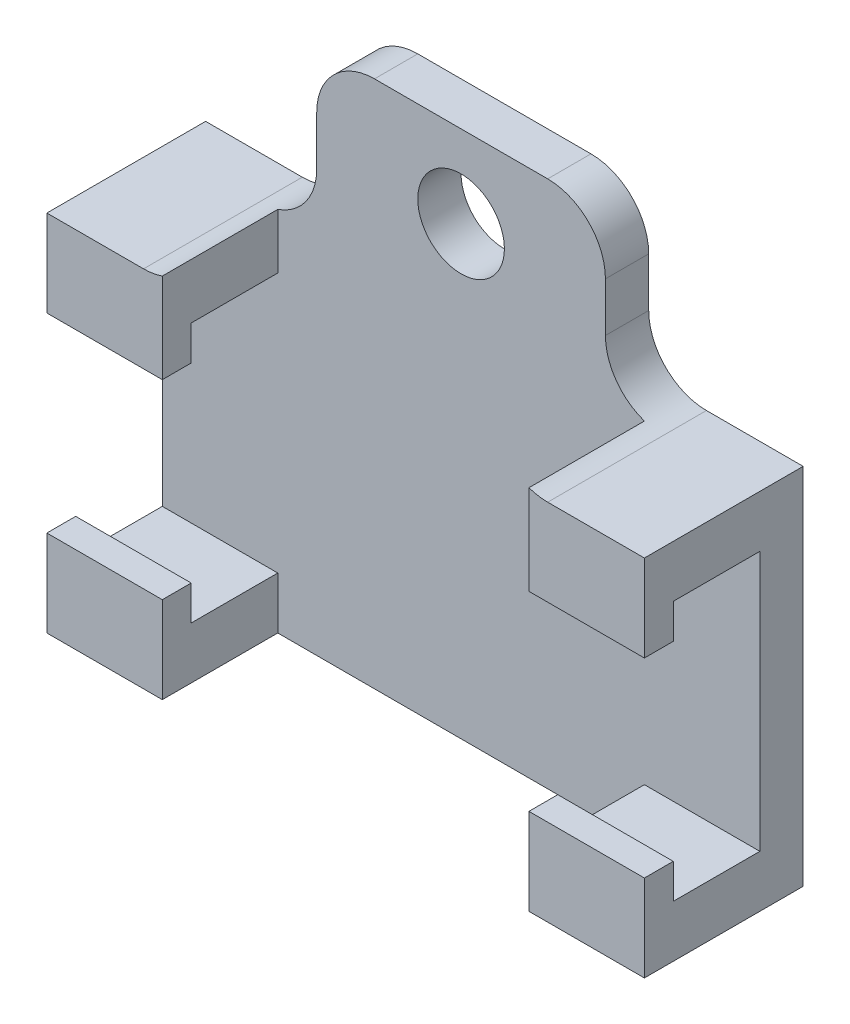
ISO-10303-21;
HEADER;
FILE_DESCRIPTION(('STEP AP214'),'2;1');
FILE_NAME('part.step','',(''),(''),'','','');
FILE_SCHEMA(('AUTOMOTIVE_DESIGN { 1 0 10303 214 1 1 1 1 }'));
ENDSEC;
DATA;
#1=APPLICATION_CONTEXT('core data for automotive mechanical design processes');
#2=APPLICATION_PROTOCOL_DEFINITION('international standard','automotive_design',2000,#1);
#3=PRODUCT_CONTEXT('',#1,'mechanical');
#4=PRODUCT('Part','Part','',(#3));
#5=PRODUCT_RELATED_PRODUCT_CATEGORY('part','',(#4));
#6=PRODUCT_DEFINITION_FORMATION('','',#4);
#7=PRODUCT_DEFINITION_CONTEXT('part definition',#1,'design');
#8=PRODUCT_DEFINITION('design','',#6,#7);
#9=PRODUCT_DEFINITION_SHAPE('','',#8);
#10=(LENGTH_UNIT() NAMED_UNIT(*) SI_UNIT(.MILLI.,.METRE.));
#11=(NAMED_UNIT(*) PLANE_ANGLE_UNIT() SI_UNIT($,.RADIAN.));
#12=(NAMED_UNIT(*) SI_UNIT($,.STERADIAN.) SOLID_ANGLE_UNIT());
#13=UNCERTAINTY_MEASURE_WITH_UNIT(LENGTH_MEASURE(1.E-05),#10,'distance_accuracy_value','');
#14=(GEOMETRIC_REPRESENTATION_CONTEXT(3) GLOBAL_UNCERTAINTY_ASSIGNED_CONTEXT((#13)) GLOBAL_UNIT_ASSIGNED_CONTEXT((#10,
#11,#12)) REPRESENTATION_CONTEXT('',''));
#15=CARTESIAN_POINT('',(0.,0.,0.));
#16=DIRECTION('',(0.,0.,1.));
#17=DIRECTION('',(1.,0.,0.));
#18=AXIS2_PLACEMENT_3D('',#15,#16,#17);
#19=CARTESIAN_POINT('',(0.,-2.65,-17.95));
#20=DIRECTION('',(0.,1.,0.));
#21=DIRECTION('',(-1.,0.,0.));
#22=AXIS2_PLACEMENT_3D('',#19,#20,#21);
#23=PLANE('',#22);
#24=DIRECTION('',(-1.,0.,0.));
#25=VECTOR('',#24,1.);
#26=CARTESIAN_POINT('',(0.,-2.65,-18.95));
#27=LINE('',#26,#25);
#28=CARTESIAN_POINT('',(4.,-2.65,-18.95));
#29=VERTEX_POINT('',#28);
#30=CARTESIAN_POINT('',(0.,-2.65,-18.95));
#31=VERTEX_POINT('',#30);
#32=EDGE_CURVE('E450',#29,#31,#27,.T.);
#33=ORIENTED_EDGE('',*,*,#32,.F.);
#34=DIRECTION('',(0.,0.,1.));
#35=VECTOR('',#34,1.);
#36=CARTESIAN_POINT('',(4.,-2.65,-17.95));
#37=LINE('',#36,#35);
#38=CARTESIAN_POINT('',(4.,-2.65,-17.95));
#39=VERTEX_POINT('',#38);
#40=EDGE_CURVE('E419',#29,#39,#37,.T.);
#41=ORIENTED_EDGE('',*,*,#40,.T.);
#42=DIRECTION('',(1.,0.,0.));
#43=VECTOR('',#42,1.);
#44=CARTESIAN_POINT('',(0.,-2.65,-17.95));
#45=LINE('',#44,#43);
#46=CARTESIAN_POINT('',(0.,-2.65,-17.95));
#47=VERTEX_POINT('',#46);
#48=EDGE_CURVE('E498',#47,#39,#45,.T.);
#49=ORIENTED_EDGE('',*,*,#48,.F.);
#50=DIRECTION('',(0.,0.,-1.));
#51=VECTOR('',#50,1.);
#52=CARTESIAN_POINT('',(0.,-2.65,-17.95));
#53=LINE('',#52,#51);
#54=EDGE_CURVE('E280',#47,#31,#53,.T.);
#55=ORIENTED_EDGE('',*,*,#54,.T.);
#56=EDGE_LOOP('',(#33,#41,#49,#55));
#57=FACE_BOUND('',#56,.T.);
#58=ADVANCED_FACE('F39',(#57),#23,.F.);
#59=CARTESIAN_POINT('',(0.,0.349999999999996,-17.95));
#60=DIRECTION('',(0.,-1.,0.));
#61=DIRECTION('',(1.,0.,0.));
#62=AXIS2_PLACEMENT_3D('',#59,#60,#61);
#63=PLANE('',#62);
#64=DIRECTION('',(-1.,0.,0.));
#65=VECTOR('',#64,1.);
#66=CARTESIAN_POINT('',(0.,0.349999999999996,-17.95));
#67=LINE('',#66,#65);
#68=CARTESIAN_POINT('',(3.35,0.349999999999996,-17.95));
#69=VERTEX_POINT('',#68);
#70=CARTESIAN_POINT('',(0.,0.349999999999996,-17.95));
#71=VERTEX_POINT('',#70);
#72=EDGE_CURVE('E503',#69,#71,#67,.T.);
#73=ORIENTED_EDGE('',*,*,#72,.F.);
#74=DIRECTION('',(0.,0.,1.));
#75=VECTOR('',#74,1.);
#76=CARTESIAN_POINT('',(3.35,0.350000000000017,-23.45));
#77=LINE('',#76,#75);
#78=CARTESIAN_POINT('',(3.35,0.350000000000017,-23.45));
#79=VERTEX_POINT('',#78);
#80=EDGE_CURVE('E266',#69,#79,#77,.F.);
#81=ORIENTED_EDGE('',*,*,#80,.T.);
#82=DIRECTION('',(1.,0.,0.));
#83=VECTOR('',#82,1.);
#84=CARTESIAN_POINT('',(0.,0.350000000000017,-23.45));
#85=LINE('',#84,#83);
#86=CARTESIAN_POINT('',(0.,0.350000000000017,-23.45));
#87=VERTEX_POINT('',#86);
#88=EDGE_CURVE('E263',#87,#79,#85,.T.);
#89=ORIENTED_EDGE('',*,*,#88,.F.);
#90=DIRECTION('',(0.,0.,-1.));
#91=VECTOR('',#90,1.);
#92=CARTESIAN_POINT('',(0.,0.349999999999996,-17.95));
#93=LINE('',#92,#91);
#94=EDGE_CURVE('E247',#71,#87,#93,.T.);
#95=ORIENTED_EDGE('',*,*,#94,.F.);
#96=EDGE_LOOP('',(#73,#81,#89,#95));
#97=FACE_BOUND('',#96,.T.);
#98=ADVANCED_FACE('F264',(#97),#63,.F.);
#99=CARTESIAN_POINT('',(0.,-17.95,-17.9500000000001));
#100=DIRECTION('',(0.,0.,-1.));
#101=DIRECTION('',(0.,1.,0.));
#102=AXIS2_PLACEMENT_3D('',#99,#100,#101);
#103=PLANE('',#102);
#104=ORIENTED_EDGE('',*,*,#48,.T.);
#105=DIRECTION('',(0.,-1.,0.));
#106=VECTOR('',#105,1.);
#107=CARTESIAN_POINT('',(4.,6.04999999999999,-17.95));
#108=LINE('',#107,#106);
#109=CARTESIAN_POINT('',(4.,0.458571968062201,-17.95));
#110=VERTEX_POINT('',#109);
#111=EDGE_CURVE('E384',#110,#39,#108,.T.);
#112=ORIENTED_EDGE('',*,*,#111,.F.);
#113=CARTESIAN_POINT('',(3.35,2.35,-17.95));
#114=DIRECTION('',(0.,0.,-1.));
#115=DIRECTION('',(0.,1.,0.));
#116=AXIS2_PLACEMENT_3D('',#113,#114,#115);
#117=CIRCLE('',#116,2.);
#118=EDGE_CURVE('E334',#110,#69,#117,.T.);
#119=ORIENTED_EDGE('',*,*,#118,.T.);
#120=ORIENTED_EDGE('',*,*,#72,.T.);
#121=DIRECTION('',(0.,-1.,0.));
#122=VECTOR('',#121,1.);
#123=CARTESIAN_POINT('',(0.,-2.65,-17.95));
#124=LINE('',#123,#122);
#125=EDGE_CURVE('E256',#71,#47,#124,.T.);
#126=ORIENTED_EDGE('',*,*,#125,.T.);
#127=EDGE_LOOP('',(#104,#112,#119,#120,#126));
#128=FACE_BOUND('',#127,.T.);
#129=ADVANCED_FACE('F621',(#128),#103,.F.);
#130=CARTESIAN_POINT('',(0.,-9.25000000000001,-17.95));
#131=DIRECTION('',(0.,-1.,0.));
#132=DIRECTION('',(1.,0.,0.));
#133=AXIS2_PLACEMENT_3D('',#130,#131,#132);
#134=PLANE('',#133);
#135=DIRECTION('',(-1.,0.,0.));
#136=VECTOR('',#135,1.);
#137=CARTESIAN_POINT('',(0.,-9.25000000000001,-17.95));
#138=LINE('',#137,#136);
#139=CARTESIAN_POINT('',(4.,-9.25000000000001,-17.95));
#140=VERTEX_POINT('',#139);
#141=CARTESIAN_POINT('',(0.,-9.25000000000001,-17.95));
#142=VERTEX_POINT('',#141);
#143=EDGE_CURVE('E482',#140,#142,#138,.T.);
#144=ORIENTED_EDGE('',*,*,#143,.F.);
#145=DIRECTION('',(0.,0.,-1.));
#146=VECTOR('',#145,1.);
#147=CARTESIAN_POINT('',(4.,-9.25000000000001,-17.95));
#148=LINE('',#147,#146);
#149=CARTESIAN_POINT('',(4.,-9.25,-18.95));
#150=VERTEX_POINT('',#149);
#151=EDGE_CURVE('E410',#140,#150,#148,.T.);
#152=ORIENTED_EDGE('',*,*,#151,.T.);
#153=DIRECTION('',(1.,0.,0.));
#154=VECTOR('',#153,1.);
#155=CARTESIAN_POINT('',(20.7,-9.25,-18.95));
#156=LINE('',#155,#154);
#157=CARTESIAN_POINT('',(0.,-9.25,-18.95));
#158=VERTEX_POINT('',#157);
#159=EDGE_CURVE('E434',#158,#150,#156,.T.);
#160=ORIENTED_EDGE('',*,*,#159,.F.);
#161=DIRECTION('',(0.,0.,-1.));
#162=VECTOR('',#161,1.);
#163=CARTESIAN_POINT('',(0.,-9.25000000000001,-17.95));
#164=LINE('',#163,#162);
#165=EDGE_CURVE('E486',#142,#158,#164,.T.);
#166=ORIENTED_EDGE('',*,*,#165,.F.);
#167=EDGE_LOOP('',(#144,#152,#160,#166));
#168=FACE_BOUND('',#167,.T.);
#169=ADVANCED_FACE('F558',(#168),#134,.F.);
#170=CARTESIAN_POINT('',(0.,-17.95,-17.9500000000001));
#171=DIRECTION('',(0.,0.,1.));
#172=DIRECTION('',(0.,-1.,0.));
#173=AXIS2_PLACEMENT_3D('',#170,#171,#172);
#174=PLANE('',#173);
#175=CARTESIAN_POINT('',(4.,-12.25,-17.9500000000001));
#176=VERTEX_POINT('',#175);
#177=EDGE_CURVE('E382',#140,#176,#108,.T.);
#178=ORIENTED_EDGE('',*,*,#177,.F.);
#179=ORIENTED_EDGE('',*,*,#143,.T.);
#180=DIRECTION('',(0.,-1.,0.));
#181=VECTOR('',#180,1.);
#182=CARTESIAN_POINT('',(0.,-9.25000000000001,-17.95));
#183=LINE('',#182,#181);
#184=CARTESIAN_POINT('',(0.,-12.25,-17.9500000000001));
#185=VERTEX_POINT('',#184);
#186=EDGE_CURVE('E472',#142,#185,#183,.T.);
#187=ORIENTED_EDGE('',*,*,#186,.T.);
#188=DIRECTION('',(1.,0.,0.));
#189=VECTOR('',#188,1.);
#190=CARTESIAN_POINT('',(0.,-12.25,-17.9500000000001));
#191=LINE('',#190,#189);
#192=EDGE_CURVE('E477',#185,#176,#191,.T.);
#193=ORIENTED_EDGE('',*,*,#192,.T.);
#194=EDGE_LOOP('',(#178,#179,#187,#193));
#195=FACE_BOUND('',#194,.T.);
#196=ADVANCED_FACE('F562',(#195),#174,.T.);
#197=CARTESIAN_POINT('',(0.,-1.45,-18.95));
#198=DIRECTION('',(0.,0.,1.));
#199=DIRECTION('',(0.,-1.,0.));
#200=AXIS2_PLACEMENT_3D('',#197,#198,#199);
#201=PLANE('',#200);
#202=DIRECTION('',(-1.,0.,0.));
#203=VECTOR('',#202,1.);
#204=CARTESIAN_POINT('',(0.,-1.45,-18.95));
#205=LINE('',#204,#203);
#206=CARTESIAN_POINT('',(4.,-1.45,-18.95));
#207=VERTEX_POINT('',#206);
#208=CARTESIAN_POINT('',(0.,-1.45,-18.95));
#209=VERTEX_POINT('',#208);
#210=EDGE_CURVE('E462',#207,#209,#205,.T.);
#211=ORIENTED_EDGE('',*,*,#210,.F.);
#212=DIRECTION('',(0.,-1.,0.));
#213=VECTOR('',#212,1.);
#214=CARTESIAN_POINT('',(4.,-1.45,-18.95));
#215=LINE('',#214,#213);
#216=EDGE_CURVE('E416',#207,#29,#215,.T.);
#217=ORIENTED_EDGE('',*,*,#216,.T.);
#218=ORIENTED_EDGE('',*,*,#32,.T.);
#219=DIRECTION('',(0.,-1.,0.));
#220=VECTOR('',#219,1.);
#221=CARTESIAN_POINT('',(0.,-1.45,-18.95));
#222=LINE('',#221,#220);
#223=EDGE_CURVE('E469',#209,#31,#222,.T.);
#224=ORIENTED_EDGE('',*,*,#223,.F.);
#225=EDGE_LOOP('',(#211,#217,#218,#224));
#226=FACE_BOUND('',#225,.T.);
#227=ADVANCED_FACE('F750',(#226),#201,.F.);
#228=CARTESIAN_POINT('',(0.,-1.44999999999999,-23.45));
#229=DIRECTION('',(0.,1.,0.));
#230=DIRECTION('',(-1.,0.,0.));
#231=AXIS2_PLACEMENT_3D('',#228,#229,#230);
#232=PLANE('',#231);
#233=DIRECTION('',(1.,0.,0.));
#234=VECTOR('',#233,1.);
#235=CARTESIAN_POINT('',(0.,-1.44999999999999,-21.95));
#236=LINE('',#235,#234);
#237=CARTESIAN_POINT('',(0.,-1.44999999999999,-21.95));
#238=VERTEX_POINT('',#237);
#239=CARTESIAN_POINT('',(4.,-1.44999999999999,-21.95));
#240=VERTEX_POINT('',#239);
#241=EDGE_CURVE('E457',#238,#240,#236,.T.);
#242=ORIENTED_EDGE('',*,*,#241,.T.);
#243=DIRECTION('',(0.,0.,1.));
#244=VECTOR('',#243,1.);
#245=CARTESIAN_POINT('',(4.,-1.44999999999999,-23.45));
#246=LINE('',#245,#244);
#247=EDGE_CURVE('E413',#240,#207,#246,.T.);
#248=ORIENTED_EDGE('',*,*,#247,.T.);
#249=ORIENTED_EDGE('',*,*,#210,.T.);
#250=DIRECTION('',(0.,0.,-1.));
#251=VECTOR('',#250,1.);
#252=CARTESIAN_POINT('',(0.,-1.44999999999999,-21.95));
#253=LINE('',#252,#251);
#254=EDGE_CURVE('E452',#209,#238,#253,.T.);
#255=ORIENTED_EDGE('',*,*,#254,.T.);
#256=EDGE_LOOP('',(#242,#248,#249,#255));
#257=FACE_BOUND('',#256,.T.);
#258=ADVANCED_FACE('F542',(#257),#232,.F.);
#259=CARTESIAN_POINT('',(20.7,-10.45,-18.95));
#260=DIRECTION('',(0.,0.,1.));
#261=DIRECTION('',(0.,-1.,0.));
#262=AXIS2_PLACEMENT_3D('',#259,#260,#261);
#263=PLANE('',#262);
#264=ORIENTED_EDGE('',*,*,#159,.T.);
#265=DIRECTION('',(0.,-1.,0.));
#266=VECTOR('',#265,1.);
#267=CARTESIAN_POINT('',(4.,-10.45,-18.95));
#268=LINE('',#267,#266);
#269=CARTESIAN_POINT('',(4.,-10.45,-18.95));
#270=VERTEX_POINT('',#269);
#271=EDGE_CURVE('E407',#150,#270,#268,.T.);
#272=ORIENTED_EDGE('',*,*,#271,.T.);
#273=DIRECTION('',(1.,0.,0.));
#274=VECTOR('',#273,1.);
#275=CARTESIAN_POINT('',(20.7,-10.45,-18.95));
#276=LINE('',#275,#274);
#277=CARTESIAN_POINT('',(0.,-10.45,-18.95));
#278=VERTEX_POINT('',#277);
#279=EDGE_CURVE('E441',#278,#270,#276,.T.);
#280=ORIENTED_EDGE('',*,*,#279,.F.);
#281=DIRECTION('',(0.,1.,0.));
#282=VECTOR('',#281,1.);
#283=CARTESIAN_POINT('',(0.,-10.45,-18.95));
#284=LINE('',#283,#282);
#285=EDGE_CURVE('E444',#278,#158,#284,.T.);
#286=ORIENTED_EDGE('',*,*,#285,.T.);
#287=EDGE_LOOP('',(#264,#272,#280,#286));
#288=FACE_BOUND('',#287,.T.);
#289=ADVANCED_FACE('F551',(#288),#263,.F.);
#290=CARTESIAN_POINT('',(0.,-10.45,-23.45));
#291=DIRECTION('',(0.,-1.,0.));
#292=DIRECTION('',(1.,0.,0.));
#293=AXIS2_PLACEMENT_3D('',#290,#291,#292);
#294=PLANE('',#293);
#295=ORIENTED_EDGE('',*,*,#279,.T.);
#296=DIRECTION('',(0.,0.,-1.));
#297=VECTOR('',#296,1.);
#298=CARTESIAN_POINT('',(4.,-10.45,-23.45));
#299=LINE('',#298,#297);
#300=CARTESIAN_POINT('',(4.,-10.45,-21.95));
#301=VERTEX_POINT('',#300);
#302=EDGE_CURVE('E298',#270,#301,#299,.T.);
#303=ORIENTED_EDGE('',*,*,#302,.T.);
#304=DIRECTION('',(-1.,0.,0.));
#305=VECTOR('',#304,1.);
#306=CARTESIAN_POINT('',(20.7,-10.45,-21.95));
#307=LINE('',#306,#305);
#308=CARTESIAN_POINT('',(0.,-10.45,-21.95));
#309=VERTEX_POINT('',#308);
#310=EDGE_CURVE('E433',#301,#309,#307,.T.);
#311=ORIENTED_EDGE('',*,*,#310,.T.);
#312=DIRECTION('',(0.,0.,1.));
#313=VECTOR('',#312,1.);
#314=CARTESIAN_POINT('',(0.,-10.45,-21.95));
#315=LINE('',#314,#313);
#316=EDGE_CURVE('E438',#309,#278,#315,.T.);
#317=ORIENTED_EDGE('',*,*,#316,.T.);
#318=EDGE_LOOP('',(#295,#303,#311,#317));
#319=FACE_BOUND('',#318,.T.);
#320=ADVANCED_FACE('F549',(#319),#294,.F.);
#321=CARTESIAN_POINT('',(0.,-17.95,-21.9500000000001));
#322=DIRECTION('',(1.,0.,0.));
#323=DIRECTION('',(0.,1.,0.));
#324=AXIS2_PLACEMENT_3D('',#321,#322,#323);
#325=PLANE('',#324);
#326=ORIENTED_EDGE('',*,*,#94,.T.);
#327=DIRECTION('',(0.,-1.,0.));
#328=VECTOR('',#327,1.);
#329=CARTESIAN_POINT('',(0.,-17.95,-23.4500000000001));
#330=LINE('',#329,#328);
#331=CARTESIAN_POINT('',(0.,-12.25,-23.4500000000001));
#332=VERTEX_POINT('',#331);
#333=EDGE_CURVE('E252',#87,#332,#330,.T.);
#334=ORIENTED_EDGE('',*,*,#333,.T.);
#335=DIRECTION('',(0.,0.,-1.));
#336=VECTOR('',#335,1.);
#337=CARTESIAN_POINT('',(0.,-12.25,-17.9500000000001));
#338=LINE('',#337,#336);
#339=EDGE_CURVE('E494',#185,#332,#338,.T.);
#340=ORIENTED_EDGE('',*,*,#339,.F.);
#341=ORIENTED_EDGE('',*,*,#186,.F.);
#342=ORIENTED_EDGE('',*,*,#165,.T.);
#343=ORIENTED_EDGE('',*,*,#285,.F.);
#344=ORIENTED_EDGE('',*,*,#316,.F.);
#345=DIRECTION('',(0.,-1.,0.));
#346=VECTOR('',#345,1.);
#347=CARTESIAN_POINT('',(0.,-17.95,-21.9500000000001));
#348=LINE('',#347,#346);
#349=EDGE_CURVE('E294',#238,#309,#348,.T.);
#350=ORIENTED_EDGE('',*,*,#349,.F.);
#351=ORIENTED_EDGE('',*,*,#254,.F.);
#352=ORIENTED_EDGE('',*,*,#223,.T.);
#353=ORIENTED_EDGE('',*,*,#54,.F.);
#354=ORIENTED_EDGE('',*,*,#125,.F.);
#355=EDGE_LOOP('',(#326,#334,#340,#341,#342,#343,#344,#350,#351,#352,#353,#354));
#356=FACE_BOUND('',#355,.T.);
#357=ADVANCED_FACE('F249',(#356),#325,.F.);
#358=CARTESIAN_POINT('',(20.7,-17.95,-21.9500000000001));
#359=DIRECTION('',(-1.,0.,0.));
#360=DIRECTION('',(0.,-1.,0.));
#361=AXIS2_PLACEMENT_3D('',#358,#359,#360);
#362=PLANE('',#361);
#363=DIRECTION('',(0.,1.,0.));
#364=VECTOR('',#363,1.);
#365=CARTESIAN_POINT('',(20.7,-17.95,-23.4500000000001));
#366=LINE('',#365,#364);
#367=CARTESIAN_POINT('',(20.7,-12.25,-23.4500000000001));
#368=VERTEX_POINT('',#367);
#369=CARTESIAN_POINT('',(20.7,0.35000000000002,-23.45));
#370=VERTEX_POINT('',#369);
#371=EDGE_CURVE('E279',#368,#370,#366,.T.);
#372=ORIENTED_EDGE('',*,*,#371,.T.);
#373=DIRECTION('',(0.,0.,-1.));
#374=VECTOR('',#373,1.);
#375=CARTESIAN_POINT('',(20.7,0.349999999999993,-17.95));
#376=LINE('',#375,#374);
#377=CARTESIAN_POINT('',(20.7,0.349999999999993,-17.95));
#378=VERTEX_POINT('',#377);
#379=EDGE_CURVE('E259',#378,#370,#376,.T.);
#380=ORIENTED_EDGE('',*,*,#379,.F.);
#381=DIRECTION('',(0.,1.,0.));
#382=VECTOR('',#381,1.);
#383=CARTESIAN_POINT('',(20.7,-2.65,-17.95));
#384=LINE('',#383,#382);
#385=CARTESIAN_POINT('',(20.7,-2.65,-17.95));
#386=VERTEX_POINT('',#385);
#387=EDGE_CURVE('E501',#386,#378,#384,.T.);
#388=ORIENTED_EDGE('',*,*,#387,.F.);
#389=DIRECTION('',(0.,0.,-1.));
#390=VECTOR('',#389,1.);
#391=CARTESIAN_POINT('',(20.7,-2.65,-17.95));
#392=LINE('',#391,#390);
#393=CARTESIAN_POINT('',(20.7,-2.65,-18.95));
#394=VERTEX_POINT('',#393);
#395=EDGE_CURVE('E286',#386,#394,#392,.T.);
#396=ORIENTED_EDGE('',*,*,#395,.T.);
#397=DIRECTION('',(0.,-1.,0.));
#398=VECTOR('',#397,1.);
#399=CARTESIAN_POINT('',(20.7,-1.45,-18.95));
#400=LINE('',#399,#398);
#401=CARTESIAN_POINT('',(20.7,-1.45,-18.95));
#402=VERTEX_POINT('',#401);
#403=EDGE_CURVE('E466',#402,#394,#400,.T.);
#404=ORIENTED_EDGE('',*,*,#403,.F.);
#405=DIRECTION('',(0.,0.,1.));
#406=VECTOR('',#405,1.);
#407=CARTESIAN_POINT('',(20.7,-1.44999999999999,-21.95));
#408=LINE('',#407,#406);
#409=CARTESIAN_POINT('',(20.7,-1.44999999999999,-21.95));
#410=VERTEX_POINT('',#409);
#411=EDGE_CURVE('E460',#410,#402,#408,.T.);
#412=ORIENTED_EDGE('',*,*,#411,.F.);
#413=DIRECTION('',(0.,1.,0.));
#414=VECTOR('',#413,1.);
#415=CARTESIAN_POINT('',(20.7,-17.95,-21.9500000000001));
#416=LINE('',#415,#414);
#417=CARTESIAN_POINT('',(20.7,-10.45,-21.95));
#418=VERTEX_POINT('',#417);
#419=EDGE_CURVE('E509',#418,#410,#416,.T.);
#420=ORIENTED_EDGE('',*,*,#419,.F.);
#421=DIRECTION('',(0.,0.,-1.));
#422=VECTOR('',#421,1.);
#423=CARTESIAN_POINT('',(20.7,-10.45,-21.95));
#424=LINE('',#423,#422);
#425=CARTESIAN_POINT('',(20.7,-10.45,-18.95));
#426=VERTEX_POINT('',#425);
#427=EDGE_CURVE('E430',#426,#418,#424,.T.);
#428=ORIENTED_EDGE('',*,*,#427,.F.);
#429=DIRECTION('',(0.,1.,0.));
#430=VECTOR('',#429,1.);
#431=CARTESIAN_POINT('',(20.7,-10.45,-18.95));
#432=LINE('',#431,#430);
#433=CARTESIAN_POINT('',(20.7,-9.25,-18.95));
#434=VERTEX_POINT('',#433);
#435=EDGE_CURVE('E447',#426,#434,#432,.T.);
#436=ORIENTED_EDGE('',*,*,#435,.T.);
#437=DIRECTION('',(0.,0.,-1.));
#438=VECTOR('',#437,1.);
#439=CARTESIAN_POINT('',(20.7,-9.25000000000001,-17.95));
#440=LINE('',#439,#438);
#441=CARTESIAN_POINT('',(20.7,-9.25000000000001,-17.95));
#442=VERTEX_POINT('',#441);
#443=EDGE_CURVE('E489',#442,#434,#440,.T.);
#444=ORIENTED_EDGE('',*,*,#443,.F.);
#445=DIRECTION('',(0.,1.,0.));
#446=VECTOR('',#445,1.);
#447=CARTESIAN_POINT('',(20.7,-9.25000000000001,-17.95));
#448=LINE('',#447,#446);
#449=CARTESIAN_POINT('',(20.7,-12.25,-17.9500000000001));
#450=VERTEX_POINT('',#449);
#451=EDGE_CURVE('E480',#450,#442,#448,.T.);
#452=ORIENTED_EDGE('',*,*,#451,.F.);
#453=DIRECTION('',(0.,0.,-1.));
#454=VECTOR('',#453,1.);
#455=CARTESIAN_POINT('',(20.7,-12.25,-17.9500000000001));
#456=LINE('',#455,#454);
#457=EDGE_CURVE('E492',#450,#368,#456,.T.);
#458=ORIENTED_EDGE('',*,*,#457,.T.);
#459=EDGE_LOOP('',(#372,#380,#388,#396,#404,#412,#420,#428,#436,#444,#452,#458));
#460=FACE_BOUND('',#459,.T.);
#461=ADVANCED_FACE('F578',(#460),#362,.F.);
#462=CARTESIAN_POINT('',(0.,-17.95,-23.4500000000001));
#463=DIRECTION('',(0.,0.,-1.));
#464=DIRECTION('',(0.,1.,0.));
#465=AXIS2_PLACEMENT_3D('',#462,#463,#464);
#466=PLANE('',#465);
#467=DIRECTION('',(0.,1.,0.));
#468=VECTOR('',#467,1.);
#469=CARTESIAN_POINT('',(5.35,6.05000000000001,-23.45));
#470=LINE('',#469,#468);
#471=CARTESIAN_POINT('',(5.35,2.35000000000002,-23.45));
#472=VERTEX_POINT('',#471);
#473=CARTESIAN_POINT('',(5.35,4.05000000000001,-23.45));
#474=VERTEX_POINT('',#473);
#475=EDGE_CURVE('E269',#472,#474,#470,.T.);
#476=ORIENTED_EDGE('',*,*,#475,.T.);
#477=CARTESIAN_POINT('',(7.35,4.05000000000001,-23.45));
#478=DIRECTION('',(0.,0.,-1.));
#479=DIRECTION('',(0.,1.,0.));
#480=AXIS2_PLACEMENT_3D('',#477,#478,#479);
#481=CIRCLE('',#480,2.);
#482=CARTESIAN_POINT('',(7.35,6.05000000000001,-23.45));
#483=VERTEX_POINT('',#482);
#484=EDGE_CURVE('E318',#474,#483,#481,.T.);
#485=ORIENTED_EDGE('',*,*,#484,.T.);
#486=DIRECTION('',(-1.,0.,0.));
#487=VECTOR('',#486,1.);
#488=CARTESIAN_POINT('',(0.,6.05000000000001,-23.45));
#489=LINE('',#488,#487);
#490=CARTESIAN_POINT('',(13.35,6.05000000000001,-23.45));
#491=VERTEX_POINT('',#490);
#492=EDGE_CURVE('E283',#491,#483,#489,.T.);
#493=ORIENTED_EDGE('',*,*,#492,.F.);
#494=CARTESIAN_POINT('',(13.35,4.05000000000001,-23.45));
#495=DIRECTION('',(0.,0.,-1.));
#496=DIRECTION('',(0.,1.,0.));
#497=AXIS2_PLACEMENT_3D('',#494,#495,#496);
#498=CIRCLE('',#497,2.);
#499=CARTESIAN_POINT('',(15.35,4.05000000000001,-23.45));
#500=VERTEX_POINT('',#499);
#501=EDGE_CURVE('E316',#491,#500,#498,.T.);
#502=ORIENTED_EDGE('',*,*,#501,.T.);
#503=DIRECTION('',(0.,-1.,0.));
#504=VECTOR('',#503,1.);
#505=CARTESIAN_POINT('',(15.35,6.05000000000001,-23.45));
#506=LINE('',#505,#504);
#507=CARTESIAN_POINT('',(15.35,2.35000000000002,-23.45));
#508=VERTEX_POINT('',#507);
#509=EDGE_CURVE('E356',#500,#508,#506,.T.);
#510=ORIENTED_EDGE('',*,*,#509,.T.);
#511=CARTESIAN_POINT('',(17.35,2.35000000000002,-23.45));
#512=DIRECTION('',(0.,0.,-1.));
#513=DIRECTION('',(0.,1.,0.));
#514=AXIS2_PLACEMENT_3D('',#511,#512,#513);
#515=CIRCLE('',#514,2.);
#516=CARTESIAN_POINT('',(17.35,0.350000000000017,-23.45));
#517=VERTEX_POINT('',#516);
#518=EDGE_CURVE('E12',#508,#517,#515,.F.);
#519=ORIENTED_EDGE('',*,*,#518,.T.);
#520=DIRECTION('',(1.,0.,0.));
#521=VECTOR('',#520,1.);
#522=CARTESIAN_POINT('',(20.7,0.35000000000002,-23.45));
#523=LINE('',#522,#521);
#524=EDGE_CURVE('E361',#517,#370,#523,.T.);
#525=ORIENTED_EDGE('',*,*,#524,.T.);
#526=ORIENTED_EDGE('',*,*,#371,.F.);
#527=DIRECTION('',(-1.,0.,0.));
#528=VECTOR('',#527,1.);
#529=CARTESIAN_POINT('',(0.,-12.25,-23.4500000000001));
#530=LINE('',#529,#528);
#531=EDGE_CURVE('E278',#368,#332,#530,.T.);
#532=ORIENTED_EDGE('',*,*,#531,.T.);
#533=ORIENTED_EDGE('',*,*,#333,.F.);
#534=ORIENTED_EDGE('',*,*,#88,.T.);
#535=CARTESIAN_POINT('',(3.35,2.35000000000002,-23.45));
#536=DIRECTION('',(0.,0.,-1.));
#537=DIRECTION('',(0.,1.,0.));
#538=AXIS2_PLACEMENT_3D('',#535,#536,#537);
#539=CIRCLE('',#538,2.);
#540=EDGE_CURVE('E336',#79,#472,#539,.F.);
#541=ORIENTED_EDGE('',*,*,#540,.T.);
#542=EDGE_LOOP('',(#476,#485,#493,#502,#510,#519,#525,#526,#532,#533,#534,#541));
#543=FACE_BOUND('',#542,.T.);
#544=CARTESIAN_POINT('',(10.35,3.20000000000002,-23.45));
#545=DIRECTION('',(0.,0.,1.));
#546=DIRECTION('',(0.,-1.,0.));
#547=AXIS2_PLACEMENT_3D('',#544,#545,#546);
#548=CIRCLE('',#547,1.5);
#549=CARTESIAN_POINT('',(10.35,1.70000000000001,-23.45));
#550=VERTEX_POINT('',#549);
#551=EDGE_CURVE('E424',#550,#550,#548,.T.);
#552=ORIENTED_EDGE('',*,*,#551,.T.);
#553=EDGE_LOOP('',(#552));
#554=FACE_BOUND('',#553,.T.);
#555=ADVANCED_FACE('F274',(#543,#554),#466,.T.);
#556=CARTESIAN_POINT('',(0.,-17.95,-21.9500000000001));
#557=DIRECTION('',(0.,0.,-1.));
#558=DIRECTION('',(0.,1.,0.));
#559=AXIS2_PLACEMENT_3D('',#556,#557,#558);
#560=PLANE('',#559);
#561=DIRECTION('',(-1.,0.,0.));
#562=VECTOR('',#561,1.);
#563=CARTESIAN_POINT('',(0.,6.05000000000001,-21.95));
#564=LINE('',#563,#562);
#565=CARTESIAN_POINT('',(13.35,6.05000000000001,-21.95));
#566=VERTEX_POINT('',#565);
#567=CARTESIAN_POINT('',(7.35,6.05000000000001,-21.95));
#568=VERTEX_POINT('',#567);
#569=EDGE_CURVE('E289',#566,#568,#564,.T.);
#570=ORIENTED_EDGE('',*,*,#569,.T.);
#571=CARTESIAN_POINT('',(7.35,4.05000000000001,-21.95));
#572=DIRECTION('',(0.,0.,-1.));
#573=DIRECTION('',(0.,1.,0.));
#574=AXIS2_PLACEMENT_3D('',#571,#572,#573);
#575=CIRCLE('',#574,2.);
#576=CARTESIAN_POINT('',(5.35,4.05000000000001,-21.95));
#577=VERTEX_POINT('',#576);
#578=EDGE_CURVE('E314',#568,#577,#575,.F.);
#579=ORIENTED_EDGE('',*,*,#578,.T.);
#580=DIRECTION('',(0.,1.,0.));
#581=VECTOR('',#580,1.);
#582=CARTESIAN_POINT('',(5.35,6.05000000000001,-21.95));
#583=LINE('',#582,#581);
#584=CARTESIAN_POINT('',(5.35,2.35000000000001,-21.95));
#585=VERTEX_POINT('',#584);
#586=EDGE_CURVE('E270',#585,#577,#583,.T.);
#587=ORIENTED_EDGE('',*,*,#586,.F.);
#588=CARTESIAN_POINT('',(3.35,2.35000000000001,-21.95));
#589=DIRECTION('',(0.,0.,-1.));
#590=DIRECTION('',(0.,1.,0.));
#591=AXIS2_PLACEMENT_3D('',#588,#589,#590);
#592=CIRCLE('',#591,2.);
#593=CARTESIAN_POINT('',(4.,0.458571968062219,-21.95));
#594=VERTEX_POINT('',#593);
#595=EDGE_CURVE('E328',#585,#594,#592,.T.);
#596=ORIENTED_EDGE('',*,*,#595,.T.);
#597=DIRECTION('',(0.,-1.,0.));
#598=VECTOR('',#597,1.);
#599=CARTESIAN_POINT('',(4.,6.05000000000001,-21.95));
#600=LINE('',#599,#598);
#601=EDGE_CURVE('E390',#594,#240,#600,.T.);
#602=ORIENTED_EDGE('',*,*,#601,.T.);
#603=ORIENTED_EDGE('',*,*,#241,.F.);
#604=ORIENTED_EDGE('',*,*,#349,.T.);
#605=ORIENTED_EDGE('',*,*,#310,.F.);
#606=CARTESIAN_POINT('',(4.,-12.25,-21.9500000000001));
#607=VERTEX_POINT('',#606);
#608=EDGE_CURVE('E381',#301,#607,#600,.T.);
#609=ORIENTED_EDGE('',*,*,#608,.T.);
#610=DIRECTION('',(1.,0.,0.));
#611=VECTOR('',#610,1.);
#612=CARTESIAN_POINT('',(4.,-12.25,-21.9500000000001));
#613=LINE('',#612,#611);
#614=CARTESIAN_POINT('',(16.7,-12.25,-21.9500000000001));
#615=VERTEX_POINT('',#614);
#616=EDGE_CURVE('E376',#607,#615,#613,.T.);
#617=ORIENTED_EDGE('',*,*,#616,.T.);
#618=DIRECTION('',(0.,-1.,0.));
#619=VECTOR('',#618,1.);
#620=CARTESIAN_POINT('',(16.7,6.05000000000001,-21.95));
#621=LINE('',#620,#619);
#622=CARTESIAN_POINT('',(16.7,-10.45,-21.95));
#623=VERTEX_POINT('',#622);
#624=EDGE_CURVE('E388',#623,#615,#621,.T.);
#625=ORIENTED_EDGE('',*,*,#624,.F.);
#626=EDGE_CURVE('E435',#418,#623,#307,.T.);
#627=ORIENTED_EDGE('',*,*,#626,.F.);
#628=ORIENTED_EDGE('',*,*,#419,.T.);
#629=CARTESIAN_POINT('',(16.7,-1.44999999999999,-21.95));
#630=VERTEX_POINT('',#629);
#631=EDGE_CURVE('E455',#630,#410,#236,.T.);
#632=ORIENTED_EDGE('',*,*,#631,.F.);
#633=CARTESIAN_POINT('',(16.7,0.458571968062212,-21.95));
#634=VERTEX_POINT('',#633);
#635=EDGE_CURVE('E54',#634,#630,#621,.T.);
#636=ORIENTED_EDGE('',*,*,#635,.F.);
#637=CARTESIAN_POINT('',(17.35,2.35000000000001,-21.95));
#638=DIRECTION('',(0.,0.,-1.));
#639=DIRECTION('',(0.,1.,0.));
#640=AXIS2_PLACEMENT_3D('',#637,#638,#639);
#641=CIRCLE('',#640,2.);
#642=CARTESIAN_POINT('',(15.35,2.35000000000001,-21.95));
#643=VERTEX_POINT('',#642);
#644=EDGE_CURVE('E47',#634,#643,#641,.T.);
#645=ORIENTED_EDGE('',*,*,#644,.T.);
#646=DIRECTION('',(0.,-1.,0.));
#647=VECTOR('',#646,1.);
#648=CARTESIAN_POINT('',(15.35,6.05000000000001,-21.95));
#649=LINE('',#648,#647);
#650=CARTESIAN_POINT('',(15.35,4.05000000000001,-21.95));
#651=VERTEX_POINT('',#650);
#652=EDGE_CURVE('E347',#651,#643,#649,.T.);
#653=ORIENTED_EDGE('',*,*,#652,.F.);
#654=CARTESIAN_POINT('',(13.35,4.05000000000001,-21.95));
#655=DIRECTION('',(0.,0.,-1.));
#656=DIRECTION('',(0.,1.,0.));
#657=AXIS2_PLACEMENT_3D('',#654,#655,#656);
#658=CIRCLE('',#657,2.);
#659=EDGE_CURVE('E312',#651,#566,#658,.F.);
#660=ORIENTED_EDGE('',*,*,#659,.T.);
#661=EDGE_LOOP('',(#570,#579,#587,#596,#602,#603,#604,#605,#609,#617,#625,#627,#628,#632,#636,
#645,#653,#660));
#662=FACE_BOUND('',#661,.T.);
#663=CARTESIAN_POINT('',(10.35,3.20000000000001,-21.95));
#664=DIRECTION('',(0.,0.,1.));
#665=DIRECTION('',(0.,-1.,0.));
#666=AXIS2_PLACEMENT_3D('',#663,#664,#665);
#667=CIRCLE('',#666,1.5);
#668=CARTESIAN_POINT('',(10.35,1.70000000000001,-21.95));
#669=VERTEX_POINT('',#668);
#670=EDGE_CURVE('E423',#669,#669,#667,.T.);
#671=ORIENTED_EDGE('',*,*,#670,.F.);
#672=EDGE_LOOP('',(#671));
#673=FACE_BOUND('',#672,.T.);
#674=ADVANCED_FACE('F345',(#662,#673),#560,.F.);
#675=CARTESIAN_POINT('',(0.,6.05000000000001,-21.95));
#676=DIRECTION('',(0.,-1.,0.));
#677=DIRECTION('',(1.,0.,0.));
#678=AXIS2_PLACEMENT_3D('',#675,#676,#677);
#679=PLANE('',#678);
#680=ORIENTED_EDGE('',*,*,#492,.T.);
#681=DIRECTION('',(0.,0.,1.));
#682=VECTOR('',#681,1.);
#683=CARTESIAN_POINT('',(7.35,6.05000000000001,-21.95));
#684=LINE('',#683,#682);
#685=EDGE_CURVE('E309',#483,#568,#684,.T.);
#686=ORIENTED_EDGE('',*,*,#685,.T.);
#687=ORIENTED_EDGE('',*,*,#569,.F.);
#688=DIRECTION('',(0.,0.,1.));
#689=VECTOR('',#688,1.);
#690=CARTESIAN_POINT('',(13.35,6.05000000000001,-21.95));
#691=LINE('',#690,#689);
#692=EDGE_CURVE('E307',#566,#491,#691,.F.);
#693=ORIENTED_EDGE('',*,*,#692,.T.);
#694=EDGE_LOOP('',(#680,#686,#687,#693));
#695=FACE_BOUND('',#694,.T.);
#696=ADVANCED_FACE('F517',(#695),#679,.F.);
#697=CARTESIAN_POINT('',(16.7,-2.65,-17.95));
#698=VERTEX_POINT('',#697);
#699=EDGE_CURVE('E497',#698,#386,#45,.T.);
#700=ORIENTED_EDGE('',*,*,#699,.F.);
#701=DIRECTION('',(0.,0.,-1.));
#702=VECTOR('',#701,1.);
#703=CARTESIAN_POINT('',(16.7,-2.65,-17.95));
#704=LINE('',#703,#702);
#705=CARTESIAN_POINT('',(16.7,-2.65,-18.95));
#706=VERTEX_POINT('',#705);
#707=EDGE_CURVE('E404',#698,#706,#704,.T.);
#708=ORIENTED_EDGE('',*,*,#707,.T.);
#709=EDGE_CURVE('E456',#394,#706,#27,.T.);
#710=ORIENTED_EDGE('',*,*,#709,.F.);
#711=ORIENTED_EDGE('',*,*,#395,.F.);
#712=EDGE_LOOP('',(#700,#708,#710,#711));
#713=FACE_BOUND('',#712,.T.);
#714=ADVANCED_FACE('F590',(#713),#23,.F.);
#715=ORIENTED_EDGE('',*,*,#524,.F.);
#716=DIRECTION('',(0.,0.,1.));
#717=VECTOR('',#716,1.);
#718=CARTESIAN_POINT('',(17.35,0.350000000000007,-21.95));
#719=LINE('',#718,#717);
#720=CARTESIAN_POINT('',(17.35,0.349999999999993,-17.95));
#721=VERTEX_POINT('',#720);
#722=EDGE_CURVE('E325',#517,#721,#719,.T.);
#723=ORIENTED_EDGE('',*,*,#722,.T.);
#724=EDGE_CURVE('E260',#378,#721,#67,.T.);
#725=ORIENTED_EDGE('',*,*,#724,.F.);
#726=ORIENTED_EDGE('',*,*,#379,.T.);
#727=EDGE_LOOP('',(#715,#723,#725,#726));
#728=FACE_BOUND('',#727,.T.);
#729=ADVANCED_FACE('F364',(#728),#63,.F.);
#730=ORIENTED_EDGE('',*,*,#724,.T.);
#731=CARTESIAN_POINT('',(17.35,2.34999999999999,-17.95));
#732=DIRECTION('',(0.,0.,-1.));
#733=DIRECTION('',(0.,1.,0.));
#734=AXIS2_PLACEMENT_3D('',#731,#732,#733);
#735=CIRCLE('',#734,2.);
#736=CARTESIAN_POINT('',(16.7,0.458571968062198,-17.95));
#737=VERTEX_POINT('',#736);
#738=EDGE_CURVE('E338',#721,#737,#735,.T.);
#739=ORIENTED_EDGE('',*,*,#738,.T.);
#740=DIRECTION('',(0.,-1.,0.));
#741=VECTOR('',#740,1.);
#742=CARTESIAN_POINT('',(16.7,6.04999999999999,-17.95));
#743=LINE('',#742,#741);
#744=EDGE_CURVE('E61',#737,#698,#743,.T.);
#745=ORIENTED_EDGE('',*,*,#744,.T.);
#746=ORIENTED_EDGE('',*,*,#699,.T.);
#747=ORIENTED_EDGE('',*,*,#387,.T.);
#748=EDGE_LOOP('',(#730,#739,#745,#746,#747));
#749=FACE_BOUND('',#748,.T.);
#750=ADVANCED_FACE('F594',(#749),#103,.F.);
#751=CARTESIAN_POINT('',(0.,-12.25,-17.9500000000001));
#752=DIRECTION('',(0.,1.,0.));
#753=DIRECTION('',(-1.,0.,0.));
#754=AXIS2_PLACEMENT_3D('',#751,#752,#753);
#755=PLANE('',#754);
#756=ORIENTED_EDGE('',*,*,#616,.F.);
#757=DIRECTION('',(0.,0.,-1.));
#758=VECTOR('',#757,1.);
#759=CARTESIAN_POINT('',(4.,-12.25,-17.9500000000001));
#760=LINE('',#759,#758);
#761=EDGE_CURVE('E373',#176,#607,#760,.T.);
#762=ORIENTED_EDGE('',*,*,#761,.F.);
#763=ORIENTED_EDGE('',*,*,#192,.F.);
#764=ORIENTED_EDGE('',*,*,#339,.T.);
#765=ORIENTED_EDGE('',*,*,#531,.F.);
#766=ORIENTED_EDGE('',*,*,#457,.F.);
#767=CARTESIAN_POINT('',(16.7,-12.25,-17.9500000000001));
#768=VERTEX_POINT('',#767);
#769=EDGE_CURVE('E476',#768,#450,#191,.T.);
#770=ORIENTED_EDGE('',*,*,#769,.F.);
#771=DIRECTION('',(0.,0.,1.));
#772=VECTOR('',#771,1.);
#773=CARTESIAN_POINT('',(16.7,-12.25,-17.9500000000001));
#774=LINE('',#773,#772);
#775=EDGE_CURVE('E379',#615,#768,#774,.T.);
#776=ORIENTED_EDGE('',*,*,#775,.F.);
#777=EDGE_LOOP('',(#756,#762,#763,#764,#765,#766,#770,#776));
#778=FACE_BOUND('',#777,.T.);
#779=ADVANCED_FACE('F566',(#778),#755,.F.);
#780=CARTESIAN_POINT('',(16.7,-9.25,-18.95));
#781=VERTEX_POINT('',#780);
#782=EDGE_CURVE('E427',#781,#434,#156,.T.);
#783=ORIENTED_EDGE('',*,*,#782,.F.);
#784=DIRECTION('',(0.,0.,1.));
#785=VECTOR('',#784,1.);
#786=CARTESIAN_POINT('',(16.7,-9.25000000000001,-17.95));
#787=LINE('',#786,#785);
#788=CARTESIAN_POINT('',(16.7,-9.25000000000001,-17.95));
#789=VERTEX_POINT('',#788);
#790=EDGE_CURVE('E395',#781,#789,#787,.T.);
#791=ORIENTED_EDGE('',*,*,#790,.T.);
#792=EDGE_CURVE('E483',#442,#789,#138,.T.);
#793=ORIENTED_EDGE('',*,*,#792,.F.);
#794=ORIENTED_EDGE('',*,*,#443,.T.);
#795=EDGE_LOOP('',(#783,#791,#793,#794));
#796=FACE_BOUND('',#795,.T.);
#797=ADVANCED_FACE('F602',(#796),#134,.F.);
#798=EDGE_CURVE('E385',#789,#768,#743,.T.);
#799=ORIENTED_EDGE('',*,*,#798,.T.);
#800=ORIENTED_EDGE('',*,*,#769,.T.);
#801=ORIENTED_EDGE('',*,*,#451,.T.);
#802=ORIENTED_EDGE('',*,*,#792,.T.);
#803=EDGE_LOOP('',(#799,#800,#801,#802));
#804=FACE_BOUND('',#803,.T.);
#805=ADVANCED_FACE('F598',(#804),#174,.T.);
#806=ORIENTED_EDGE('',*,*,#709,.T.);
#807=DIRECTION('',(0.,1.,0.));
#808=VECTOR('',#807,1.);
#809=CARTESIAN_POINT('',(16.7,-1.45,-18.95));
#810=LINE('',#809,#808);
#811=CARTESIAN_POINT('',(16.7,-1.45,-18.95));
#812=VERTEX_POINT('',#811);
#813=EDGE_CURVE('E401',#706,#812,#810,.T.);
#814=ORIENTED_EDGE('',*,*,#813,.T.);
#815=EDGE_CURVE('E463',#402,#812,#205,.T.);
#816=ORIENTED_EDGE('',*,*,#815,.F.);
#817=ORIENTED_EDGE('',*,*,#403,.T.);
#818=EDGE_LOOP('',(#806,#814,#816,#817));
#819=FACE_BOUND('',#818,.T.);
#820=ADVANCED_FACE('F585',(#819),#201,.F.);
#821=ORIENTED_EDGE('',*,*,#815,.T.);
#822=DIRECTION('',(0.,0.,-1.));
#823=VECTOR('',#822,1.);
#824=CARTESIAN_POINT('',(16.7,-1.44999999999999,-23.45));
#825=LINE('',#824,#823);
#826=EDGE_CURVE('E398',#812,#630,#825,.T.);
#827=ORIENTED_EDGE('',*,*,#826,.T.);
#828=ORIENTED_EDGE('',*,*,#631,.T.);
#829=ORIENTED_EDGE('',*,*,#411,.T.);
#830=EDGE_LOOP('',(#821,#827,#828,#829));
#831=FACE_BOUND('',#830,.T.);
#832=ADVANCED_FACE('F583',(#831),#232,.F.);
#833=CARTESIAN_POINT('',(16.7,-10.45,-18.95));
#834=VERTEX_POINT('',#833);
#835=EDGE_CURVE('E440',#834,#426,#276,.T.);
#836=ORIENTED_EDGE('',*,*,#835,.F.);
#837=DIRECTION('',(0.,1.,0.));
#838=VECTOR('',#837,1.);
#839=CARTESIAN_POINT('',(16.7,-10.45,-18.95));
#840=LINE('',#839,#838);
#841=EDGE_CURVE('E392',#834,#781,#840,.T.);
#842=ORIENTED_EDGE('',*,*,#841,.T.);
#843=ORIENTED_EDGE('',*,*,#782,.T.);
#844=ORIENTED_EDGE('',*,*,#435,.F.);
#845=EDGE_LOOP('',(#836,#842,#843,#844));
#846=FACE_BOUND('',#845,.T.);
#847=ADVANCED_FACE('F604',(#846),#263,.F.);
#848=ORIENTED_EDGE('',*,*,#626,.T.);
#849=DIRECTION('',(0.,0.,1.));
#850=VECTOR('',#849,1.);
#851=CARTESIAN_POINT('',(16.7,-10.45,-23.45));
#852=LINE('',#851,#850);
#853=EDGE_CURVE('E295',#623,#834,#852,.T.);
#854=ORIENTED_EDGE('',*,*,#853,.T.);
#855=ORIENTED_EDGE('',*,*,#835,.T.);
#856=ORIENTED_EDGE('',*,*,#427,.T.);
#857=EDGE_LOOP('',(#848,#854,#855,#856));
#858=FACE_BOUND('',#857,.T.);
#859=ADVANCED_FACE('F574',(#858),#294,.F.);
#860=CARTESIAN_POINT('',(10.35,3.20000000000002,-23.45));
#861=DIRECTION('',(0.,0.,1.));
#862=DIRECTION('',(0.,-1.,0.));
#863=AXIS2_PLACEMENT_3D('',#860,#861,#862);
#864=CYLINDRICAL_SURFACE('',#863,1.5);
#865=ORIENTED_EDGE('',*,*,#551,.F.);
#866=EDGE_LOOP('',(#865));
#867=FACE_BOUND('',#866,.T.);
#868=ORIENTED_EDGE('',*,*,#670,.T.);
#869=EDGE_LOOP('',(#868));
#870=FACE_BOUND('',#869,.T.);
#871=ADVANCED_FACE('F611',(#867,#870),#864,.F.);
#872=CARTESIAN_POINT('',(16.7,6.04999999999999,-17.95));
#873=DIRECTION('',(1.,0.,0.));
#874=DIRECTION('',(0.,1.,0.));
#875=AXIS2_PLACEMENT_3D('',#872,#873,#874);
#876=PLANE('',#875);
#877=ORIENTED_EDGE('',*,*,#841,.F.);
#878=ORIENTED_EDGE('',*,*,#853,.F.);
#879=ORIENTED_EDGE('',*,*,#624,.T.);
#880=ORIENTED_EDGE('',*,*,#775,.T.);
#881=ORIENTED_EDGE('',*,*,#798,.F.);
#882=ORIENTED_EDGE('',*,*,#790,.F.);
#883=EDGE_LOOP('',(#877,#878,#879,#880,#881,#882));
#884=FACE_BOUND('',#883,.T.);
#885=ADVANCED_FACE('F571',(#884),#876,.F.);
#886=CARTESIAN_POINT('',(4.,6.04999999999999,-17.95));
#887=DIRECTION('',(-1.,0.,0.));
#888=DIRECTION('',(0.,0.,-1.));
#889=AXIS2_PLACEMENT_3D('',#886,#887,#888);
#890=PLANE('',#889);
#891=ORIENTED_EDGE('',*,*,#177,.T.);
#892=ORIENTED_EDGE('',*,*,#761,.T.);
#893=ORIENTED_EDGE('',*,*,#608,.F.);
#894=ORIENTED_EDGE('',*,*,#302,.F.);
#895=ORIENTED_EDGE('',*,*,#271,.F.);
#896=ORIENTED_EDGE('',*,*,#151,.F.);
#897=EDGE_LOOP('',(#891,#892,#893,#894,#895,#896));
#898=FACE_BOUND('',#897,.T.);
#899=ADVANCED_FACE('F554',(#898),#890,.F.);
#900=ORIENTED_EDGE('',*,*,#111,.T.);
#901=ORIENTED_EDGE('',*,*,#40,.F.);
#902=ORIENTED_EDGE('',*,*,#216,.F.);
#903=ORIENTED_EDGE('',*,*,#247,.F.);
#904=ORIENTED_EDGE('',*,*,#601,.F.);
#905=DIRECTION('',(0.,0.,-1.));
#906=VECTOR('',#905,1.);
#907=CARTESIAN_POINT('',(4.,0.458571968062219,-21.95));
#908=LINE('',#907,#906);
#909=EDGE_CURVE('E331',#594,#110,#908,.F.);
#910=ORIENTED_EDGE('',*,*,#909,.T.);
#911=EDGE_LOOP('',(#900,#901,#902,#903,#904,#910));
#912=FACE_BOUND('',#911,.T.);
#913=ADVANCED_FACE('F539',(#912),#890,.F.);
#914=ORIENTED_EDGE('',*,*,#635,.T.);
#915=ORIENTED_EDGE('',*,*,#826,.F.);
#916=ORIENTED_EDGE('',*,*,#813,.F.);
#917=ORIENTED_EDGE('',*,*,#707,.F.);
#918=ORIENTED_EDGE('',*,*,#744,.F.);
#919=DIRECTION('',(0.,0.,-1.));
#920=VECTOR('',#919,1.);
#921=CARTESIAN_POINT('',(16.7,0.458571968062198,-17.95));
#922=LINE('',#921,#920);
#923=EDGE_CURVE('E340',#737,#634,#922,.T.);
#924=ORIENTED_EDGE('',*,*,#923,.T.);
#925=EDGE_LOOP('',(#914,#915,#916,#917,#918,#924));
#926=FACE_BOUND('',#925,.T.);
#927=ADVANCED_FACE('F587',(#926),#876,.F.);
#928=CARTESIAN_POINT('',(15.35,6.05000000000001,-23.45));
#929=DIRECTION('',(-1.,0.,0.));
#930=DIRECTION('',(0.,-1.,0.));
#931=AXIS2_PLACEMENT_3D('',#928,#929,#930);
#932=PLANE('',#931);
#933=ORIENTED_EDGE('',*,*,#509,.F.);
#934=DIRECTION('',(0.,0.,1.));
#935=VECTOR('',#934,1.);
#936=CARTESIAN_POINT('',(15.35,4.05000000000001,-23.45));
#937=LINE('',#936,#935);
#938=EDGE_CURVE('E322',#500,#651,#937,.T.);
#939=ORIENTED_EDGE('',*,*,#938,.T.);
#940=ORIENTED_EDGE('',*,*,#652,.T.);
#941=DIRECTION('',(0.,0.,1.));
#942=VECTOR('',#941,1.);
#943=CARTESIAN_POINT('',(15.35,2.35000000000002,-23.45));
#944=LINE('',#943,#942);
#945=EDGE_CURVE('E320',#643,#508,#944,.F.);
#946=ORIENTED_EDGE('',*,*,#945,.T.);
#947=EDGE_LOOP('',(#933,#939,#940,#946));
#948=FACE_BOUND('',#947,.T.);
#949=ADVANCED_FACE('F353',(#948),#932,.F.);
#950=CARTESIAN_POINT('',(5.35,6.05000000000001,-23.45));
#951=DIRECTION('',(1.,0.,0.));
#952=DIRECTION('',(0.,1.,0.));
#953=AXIS2_PLACEMENT_3D('',#950,#951,#952);
#954=PLANE('',#953);
#955=ORIENTED_EDGE('',*,*,#475,.F.);
#956=DIRECTION('',(0.,0.,1.));
#957=VECTOR('',#956,1.);
#958=CARTESIAN_POINT('',(5.35,2.35000000000001,-21.95));
#959=LINE('',#958,#957);
#960=EDGE_CURVE('E303',#472,#585,#959,.T.);
#961=ORIENTED_EDGE('',*,*,#960,.T.);
#962=ORIENTED_EDGE('',*,*,#586,.T.);
#963=DIRECTION('',(0.,0.,1.));
#964=VECTOR('',#963,1.);
#965=CARTESIAN_POINT('',(5.35,4.05000000000001,-23.45));
#966=LINE('',#965,#964);
#967=EDGE_CURVE('E301',#577,#474,#966,.F.);
#968=ORIENTED_EDGE('',*,*,#967,.T.);
#969=EDGE_LOOP('',(#955,#961,#962,#968));
#970=FACE_BOUND('',#969,.T.);
#971=ADVANCED_FACE('F529',(#970),#954,.F.);
#972=CARTESIAN_POINT('',(3.35,2.35000000000002,-23.45));
#973=DIRECTION('',(0.,0.,-1.));
#974=DIRECTION('',(0.,1.,0.));
#975=AXIS2_PLACEMENT_3D('',#972,#973,#974);
#976=CYLINDRICAL_SURFACE('',#975,2.);
#977=ORIENTED_EDGE('',*,*,#540,.F.);
#978=ORIENTED_EDGE('',*,*,#80,.F.);
#979=ORIENTED_EDGE('',*,*,#118,.F.);
#980=ORIENTED_EDGE('',*,*,#909,.F.);
#981=ORIENTED_EDGE('',*,*,#595,.F.);
#982=ORIENTED_EDGE('',*,*,#960,.F.);
#983=EDGE_LOOP('',(#977,#978,#979,#980,#981,#982));
#984=FACE_BOUND('',#983,.T.);
#985=ADVANCED_FACE('F533',(#984),#976,.F.);
#986=CARTESIAN_POINT('',(7.35,4.05000000000001,-21.95));
#987=DIRECTION('',(0.,0.,1.));
#988=DIRECTION('',(0.,-1.,0.));
#989=AXIS2_PLACEMENT_3D('',#986,#987,#988);
#990=CYLINDRICAL_SURFACE('',#989,2.);
#991=ORIENTED_EDGE('',*,*,#484,.F.);
#992=ORIENTED_EDGE('',*,*,#967,.F.);
#993=ORIENTED_EDGE('',*,*,#578,.F.);
#994=ORIENTED_EDGE('',*,*,#685,.F.);
#995=EDGE_LOOP('',(#991,#992,#993,#994));
#996=FACE_BOUND('',#995,.T.);
#997=ADVANCED_FACE('F525',(#996),#990,.T.);
#998=CARTESIAN_POINT('',(13.35,4.05000000000001,-23.45));
#999=DIRECTION('',(0.,0.,1.));
#1000=DIRECTION('',(0.,-1.,0.));
#1001=AXIS2_PLACEMENT_3D('',#998,#999,#1000);
#1002=CYLINDRICAL_SURFACE('',#1001,2.);
#1003=ORIENTED_EDGE('',*,*,#501,.F.);
#1004=ORIENTED_EDGE('',*,*,#692,.F.);
#1005=ORIENTED_EDGE('',*,*,#659,.F.);
#1006=ORIENTED_EDGE('',*,*,#938,.F.);
#1007=EDGE_LOOP('',(#1003,#1004,#1005,#1006));
#1008=FACE_BOUND('',#1007,.T.);
#1009=ADVANCED_FACE('F522',(#1008),#1002,.T.);
#1010=CARTESIAN_POINT('',(17.35,2.34999999999999,-17.95));
#1011=DIRECTION('',(0.,0.,-1.));
#1012=DIRECTION('',(0.,1.,0.));
#1013=AXIS2_PLACEMENT_3D('',#1010,#1011,#1012);
#1014=CYLINDRICAL_SURFACE('',#1013,2.);
#1015=ORIENTED_EDGE('',*,*,#518,.F.);
#1016=ORIENTED_EDGE('',*,*,#945,.F.);
#1017=ORIENTED_EDGE('',*,*,#644,.F.);
#1018=ORIENTED_EDGE('',*,*,#923,.F.);
#1019=ORIENTED_EDGE('',*,*,#738,.F.);
#1020=ORIENTED_EDGE('',*,*,#722,.F.);
#1021=EDGE_LOOP('',(#1015,#1016,#1017,#1018,#1019,#1020));
#1022=FACE_BOUND('',#1021,.T.);
#1023=ADVANCED_FACE('F41',(#1022),#1014,.F.);
#1024=CLOSED_SHELL('',(#58,#98,#129,#169,#196,#227,#258,#289,#320,#357,#461,#555,#674,#696,#714,
#729,#750,#779,#797,#805,#820,#832,#847,#859,#871,#885,#899,#913,#927,#949,#971,#985,#997,#1009,#1023));
#1025=MANIFOLD_SOLID_BREP('B2',#1024);
#1026=ADVANCED_BREP_SHAPE_REPRESENTATION('',(#18,#1025),#14);
#1027=SHAPE_DEFINITION_REPRESENTATION(#9,#1026);
ENDSEC;
END-ISO-10303-21;
